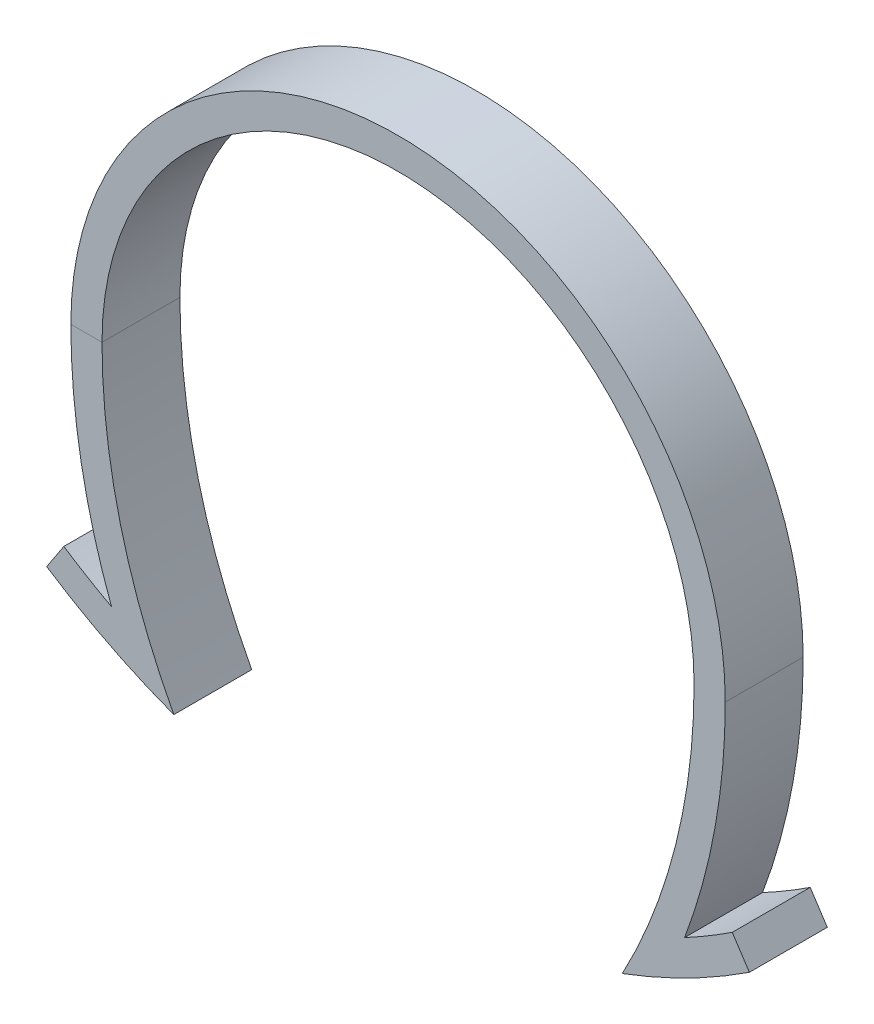
ISO-10303-21;
HEADER;
FILE_DESCRIPTION(('STEP AP214'),'2;1');
FILE_NAME('part.step','',(''),(''),'','','');
FILE_SCHEMA(('AUTOMOTIVE_DESIGN { 1 0 10303 214 1 1 1 1 }'));
ENDSEC;
DATA;
#1=APPLICATION_CONTEXT('core data for automotive mechanical design processes');
#2=APPLICATION_PROTOCOL_DEFINITION('international standard','automotive_design',2000,#1);
#3=PRODUCT_CONTEXT('',#1,'mechanical');
#4=PRODUCT('Part','Part','',(#3));
#5=PRODUCT_RELATED_PRODUCT_CATEGORY('part','',(#4));
#6=PRODUCT_DEFINITION_FORMATION('','',#4);
#7=PRODUCT_DEFINITION_CONTEXT('part definition',#1,'design');
#8=PRODUCT_DEFINITION('design','',#6,#7);
#9=PRODUCT_DEFINITION_SHAPE('','',#8);
#10=(LENGTH_UNIT() NAMED_UNIT(*) SI_UNIT(.MILLI.,.METRE.));
#11=(NAMED_UNIT(*) PLANE_ANGLE_UNIT() SI_UNIT($,.RADIAN.));
#12=(NAMED_UNIT(*) SI_UNIT($,.STERADIAN.) SOLID_ANGLE_UNIT());
#13=UNCERTAINTY_MEASURE_WITH_UNIT(LENGTH_MEASURE(1.E-05),#10,'distance_accuracy_value','');
#14=(GEOMETRIC_REPRESENTATION_CONTEXT(3) GLOBAL_UNCERTAINTY_ASSIGNED_CONTEXT((#13)) GLOBAL_UNIT_ASSIGNED_CONTEXT((#10,
#11,#12)) REPRESENTATION_CONTEXT('',''));
#15=CARTESIAN_POINT('',(0.,0.,0.));
#16=DIRECTION('',(0.,0.,1.));
#17=DIRECTION('',(1.,0.,0.));
#18=AXIS2_PLACEMENT_3D('',#15,#16,#17);
#19=CARTESIAN_POINT('',(39.637607750069,35.6493190269797,5.));
#20=DIRECTION('',(0.,0.,-1.));
#21=DIRECTION('',(-1.,0.,0.));
#22=AXIS2_PLACEMENT_3D('',#19,#20,#21);
#23=CYLINDRICAL_SURFACE('',#22,39.);
#24=CARTESIAN_POINT('',(39.637607750069,35.6493190269797,0.));
#25=DIRECTION('',(0.,0.,1.));
#26=DIRECTION('',(1.,0.,0.));
#27=AXIS2_PLACEMENT_3D('',#24,#25,#26);
#28=CIRCLE('',#27,39.);
#29=CARTESIAN_POINT('',(21.2463213092757,1.2580325861864,0.));
#30=VERTEX_POINT('',#29);
#31=CARTESIAN_POINT('',(18.187607750069,3.07789750442407,0.));
#32=VERTEX_POINT('',#31);
#33=EDGE_CURVE('E166',#30,#32,#28,.F.);
#34=ORIENTED_EDGE('',*,*,#33,.T.);
#35=DIRECTION('',(0.,0.,-1.));
#36=VECTOR('',#35,1.);
#37=CARTESIAN_POINT('',(18.187607750069,3.07789750442407,5.));
#38=LINE('',#37,#36);
#39=CARTESIAN_POINT('',(18.187607750069,3.07789750442407,5.));
#40=VERTEX_POINT('',#39);
#41=EDGE_CURVE('E13',#40,#32,#38,.T.);
#42=ORIENTED_EDGE('',*,*,#41,.F.);
#43=CARTESIAN_POINT('',(39.637607750069,35.6493190269797,5.));
#44=DIRECTION('',(0.,0.,1.));
#45=DIRECTION('',(1.,0.,0.));
#46=AXIS2_PLACEMENT_3D('',#43,#44,#45);
#47=CIRCLE('',#46,39.);
#48=CARTESIAN_POINT('',(21.2463213092757,1.2580325861864,5.));
#49=VERTEX_POINT('',#48);
#50=EDGE_CURVE('E131',#49,#40,#47,.F.);
#51=ORIENTED_EDGE('',*,*,#50,.F.);
#52=DIRECTION('',(0.,0.,-1.));
#53=VECTOR('',#52,1.);
#54=CARTESIAN_POINT('',(21.2463213092757,1.2580325861864,5.));
#55=LINE('',#54,#53);
#56=EDGE_CURVE('E162',#49,#30,#55,.T.);
#57=ORIENTED_EDGE('',*,*,#56,.T.);
#58=EDGE_LOOP('',(#34,#42,#51,#57));
#59=FACE_BOUND('',#58,.T.);
#60=ADVANCED_FACE('F85',(#59),#23,.F.);
#61=CARTESIAN_POINT('',(17.087607750069,1.40756819557506,5.));
#62=DIRECTION('',(-0.835164654424503,0.55,0.));
#63=DIRECTION('',(-0.55,-0.835164654424503,0.));
#64=AXIS2_PLACEMENT_3D('',#61,#62,#63);
#65=PLANE('',#64);
#66=DIRECTION('',(0.55,0.835164654424503,0.));
#67=VECTOR('',#66,1.);
#68=CARTESIAN_POINT('',(17.087607750069,1.40756819557506,0.));
#69=LINE('',#68,#67);
#70=CARTESIAN_POINT('',(17.087607750069,1.40756819557506,0.));
#71=VERTEX_POINT('',#70);
#72=EDGE_CURVE('E169',#71,#32,#69,.T.);
#73=ORIENTED_EDGE('',*,*,#72,.F.);
#74=DIRECTION('',(0.,0.,-1.));
#75=VECTOR('',#74,1.);
#76=CARTESIAN_POINT('',(17.087607750069,1.40756819557506,5.));
#77=LINE('',#76,#75);
#78=CARTESIAN_POINT('',(17.087607750069,1.40756819557506,5.));
#79=VERTEX_POINT('',#78);
#80=EDGE_CURVE('E93',#79,#71,#77,.T.);
#81=ORIENTED_EDGE('',*,*,#80,.F.);
#82=DIRECTION('',(0.55,0.835164654424503,0.));
#83=VECTOR('',#82,1.);
#84=CARTESIAN_POINT('',(17.087607750069,1.40756819557506,5.));
#85=LINE('',#84,#83);
#86=EDGE_CURVE('E255',#79,#40,#85,.T.);
#87=ORIENTED_EDGE('',*,*,#86,.T.);
#88=ORIENTED_EDGE('',*,*,#41,.T.);
#89=EDGE_LOOP('',(#73,#81,#87,#88));
#90=FACE_BOUND('',#89,.T.);
#91=ADVANCED_FACE('F187',(#90),#65,.T.);
#92=CARTESIAN_POINT('',(39.637607750069,35.6493190269797,5.));
#93=DIRECTION('',(0.,0.,-1.));
#94=DIRECTION('',(-1.,0.,0.));
#95=AXIS2_PLACEMENT_3D('',#92,#93,#94);
#96=CYLINDRICAL_SURFACE('',#95,41.);
#97=CARTESIAN_POINT('',(39.637607750069,35.6493190269797,0.));
#98=DIRECTION('',(0.,0.,1.));
#99=DIRECTION('',(1.,0.,0.));
#100=AXIS2_PLACEMENT_3D('',#97,#98,#99);
#101=CIRCLE('',#100,41.);
#102=CARTESIAN_POINT('',(25.2463213092757,-2.74196741381359,0.));
#103=VERTEX_POINT('',#102);
#104=EDGE_CURVE('E172',#103,#71,#101,.F.);
#105=ORIENTED_EDGE('',*,*,#104,.F.);
#106=DIRECTION('',(0.,0.,-1.));
#107=VECTOR('',#106,1.);
#108=CARTESIAN_POINT('',(25.2463213092757,-2.74196741381359,5.));
#109=LINE('',#108,#107);
#110=CARTESIAN_POINT('',(25.2463213092757,-2.74196741381359,5.));
#111=VERTEX_POINT('',#110);
#112=EDGE_CURVE('E152',#111,#103,#109,.T.);
#113=ORIENTED_EDGE('',*,*,#112,.F.);
#114=CARTESIAN_POINT('',(39.637607750069,35.6493190269797,5.));
#115=DIRECTION('',(0.,0.,1.));
#116=DIRECTION('',(1.,0.,0.));
#117=AXIS2_PLACEMENT_3D('',#114,#115,#116);
#118=CIRCLE('',#117,41.);
#119=EDGE_CURVE('E158',#111,#79,#118,.F.);
#120=ORIENTED_EDGE('',*,*,#119,.T.);
#121=ORIENTED_EDGE('',*,*,#80,.T.);
#122=EDGE_LOOP('',(#105,#113,#120,#121));
#123=FACE_BOUND('',#122,.T.);
#124=ADVANCED_FACE('F184',(#123),#96,.T.);
#125=CARTESIAN_POINT('',(59.637607750069,15.6493190269797,5.));
#126=DIRECTION('',(0.,0.,-1.));
#127=DIRECTION('',(-1.,0.,0.));
#128=AXIS2_PLACEMENT_3D('',#125,#126,#127);
#129=CYLINDRICAL_SURFACE('',#128,39.);
#130=CARTESIAN_POINT('',(59.637607750069,15.6493190269797,0.));
#131=DIRECTION('',(0.,0.,1.));
#132=DIRECTION('',(1.,0.,0.));
#133=AXIS2_PLACEMENT_3D('',#130,#131,#132);
#134=CIRCLE('',#133,39.);
#135=CARTESIAN_POINT('',(20.637607750069,15.6493190269797,0.));
#136=VERTEX_POINT('',#135);
#137=EDGE_CURVE('E147',#136,#103,#134,.T.);
#138=ORIENTED_EDGE('',*,*,#137,.F.);
#139=DIRECTION('',(0.,0.,-1.));
#140=VECTOR('',#139,1.);
#141=CARTESIAN_POINT('',(20.637607750069,15.6493190269797,5.));
#142=LINE('',#141,#140);
#143=CARTESIAN_POINT('',(20.637607750069,15.6493190269797,5.));
#144=VERTEX_POINT('',#143);
#145=EDGE_CURVE('E142',#144,#136,#142,.T.);
#146=ORIENTED_EDGE('',*,*,#145,.F.);
#147=CARTESIAN_POINT('',(59.637607750069,15.6493190269797,5.));
#148=DIRECTION('',(0.,0.,1.));
#149=DIRECTION('',(1.,0.,0.));
#150=AXIS2_PLACEMENT_3D('',#147,#148,#149);
#151=CIRCLE('',#150,39.);
#152=EDGE_CURVE('E145',#144,#111,#151,.T.);
#153=ORIENTED_EDGE('',*,*,#152,.T.);
#154=ORIENTED_EDGE('',*,*,#112,.T.);
#155=EDGE_LOOP('',(#138,#146,#153,#154));
#156=FACE_BOUND('',#155,.T.);
#157=ADVANCED_FACE('F144',(#156),#129,.F.);
#158=CARTESIAN_POINT('',(18.637607750069,15.6493190269797,5.));
#159=DIRECTION('',(0.,1.,0.));
#160=DIRECTION('',(0.,0.,1.));
#161=AXIS2_PLACEMENT_3D('',#158,#159,#160);
#162=PLANE('',#161);
#163=DIRECTION('',(1.,0.,0.));
#164=VECTOR('',#163,1.);
#165=CARTESIAN_POINT('',(18.637607750069,15.6493190269797,0.));
#166=LINE('',#165,#164);
#167=CARTESIAN_POINT('',(18.637607750069,15.6493190269797,0.));
#168=VERTEX_POINT('',#167);
#169=EDGE_CURVE('E176',#168,#136,#166,.T.);
#170=ORIENTED_EDGE('',*,*,#169,.F.);
#171=DIRECTION('',(0.,0.,-1.));
#172=VECTOR('',#171,1.);
#173=CARTESIAN_POINT('',(18.637607750069,15.6493190269797,5.));
#174=LINE('',#173,#172);
#175=CARTESIAN_POINT('',(18.637607750069,15.6493190269797,5.));
#176=VERTEX_POINT('',#175);
#177=EDGE_CURVE('E122',#176,#168,#174,.T.);
#178=ORIENTED_EDGE('',*,*,#177,.F.);
#179=DIRECTION('',(1.,0.,0.));
#180=VECTOR('',#179,1.);
#181=CARTESIAN_POINT('',(18.637607750069,15.6493190269797,5.));
#182=LINE('',#181,#180);
#183=EDGE_CURVE('E156',#176,#144,#182,.T.);
#184=ORIENTED_EDGE('',*,*,#183,.T.);
#185=ORIENTED_EDGE('',*,*,#145,.T.);
#186=EDGE_LOOP('',(#170,#178,#184,#185));
#187=FACE_BOUND('',#186,.T.);
#188=ADVANCED_FACE('F160',(#187),#162,.T.);
#189=CARTESIAN_POINT('',(59.637607750069,15.6493190269797,5.));
#190=DIRECTION('',(0.,0.,-1.));
#191=DIRECTION('',(-1.,0.,0.));
#192=AXIS2_PLACEMENT_3D('',#189,#190,#191);
#193=CYLINDRICAL_SURFACE('',#192,41.);
#194=CARTESIAN_POINT('',(59.637607750069,15.6493190269797,0.));
#195=DIRECTION('',(0.,0.,1.));
#196=DIRECTION('',(1.,0.,0.));
#197=AXIS2_PLACEMENT_3D('',#194,#195,#196);
#198=CIRCLE('',#197,41.);
#199=EDGE_CURVE('E125',#168,#30,#198,.T.);
#200=ORIENTED_EDGE('',*,*,#199,.T.);
#201=ORIENTED_EDGE('',*,*,#56,.F.);
#202=CARTESIAN_POINT('',(59.637607750069,15.6493190269797,5.));
#203=DIRECTION('',(0.,0.,1.));
#204=DIRECTION('',(1.,0.,0.));
#205=AXIS2_PLACEMENT_3D('',#202,#203,#204);
#206=CIRCLE('',#205,41.);
#207=EDGE_CURVE('E101',#176,#49,#206,.T.);
#208=ORIENTED_EDGE('',*,*,#207,.F.);
#209=ORIENTED_EDGE('',*,*,#177,.T.);
#210=EDGE_LOOP('',(#200,#201,#208,#209));
#211=FACE_BOUND('',#210,.T.);
#212=ADVANCED_FACE('F192',(#211),#193,.T.);
#213=CARTESIAN_POINT('',(39.637607750069,35.6493190269797,5.));
#214=DIRECTION('',(0.,0.,1.));
#215=DIRECTION('',(1.,0.,0.));
#216=AXIS2_PLACEMENT_3D('',#213,#214,#215);
#217=PLANE('',#216);
#218=ORIENTED_EDGE('',*,*,#50,.T.);
#219=ORIENTED_EDGE('',*,*,#86,.F.);
#220=ORIENTED_EDGE('',*,*,#119,.F.);
#221=ORIENTED_EDGE('',*,*,#152,.F.);
#222=ORIENTED_EDGE('',*,*,#183,.F.);
#223=ORIENTED_EDGE('',*,*,#207,.T.);
#224=EDGE_LOOP('',(#218,#219,#220,#221,#222,#223));
#225=FACE_BOUND('',#224,.T.);
#226=ADVANCED_FACE('F155',(#225),#217,.T.);
#227=CARTESIAN_POINT('',(39.637607750069,35.6493190269797,0.));
#228=DIRECTION('',(0.,0.,1.));
#229=DIRECTION('',(1.,0.,0.));
#230=AXIS2_PLACEMENT_3D('',#227,#228,#229);
#231=PLANE('',#230);
#232=ORIENTED_EDGE('',*,*,#33,.F.);
#233=ORIENTED_EDGE('',*,*,#199,.F.);
#234=ORIENTED_EDGE('',*,*,#169,.T.);
#235=ORIENTED_EDGE('',*,*,#137,.T.);
#236=ORIENTED_EDGE('',*,*,#104,.T.);
#237=ORIENTED_EDGE('',*,*,#72,.T.);
#238=EDGE_LOOP('',(#232,#233,#234,#235,#236,#237));
#239=FACE_BOUND('',#238,.T.);
#240=ADVANCED_FACE('F190',(#239),#231,.F.);
#241=CLOSED_SHELL('',(#60,#91,#124,#157,#188,#212,#226,#240));
#242=MANIFOLD_SOLID_BREP('B2',#241);
#243=CARTESIAN_POINT('',(39.637607750069,15.6493190269797,5.));
#244=DIRECTION('',(0.,0.,-1.));
#245=DIRECTION('',(-1.,0.,0.));
#246=AXIS2_PLACEMENT_3D('',#243,#244,#245);
#247=CYLINDRICAL_SURFACE('',#246,21.);
#248=CARTESIAN_POINT('',(39.637607750069,15.6493190269797,0.));
#249=DIRECTION('',(0.,0.,1.));
#250=DIRECTION('',(1.,0.,0.));
#251=AXIS2_PLACEMENT_3D('',#248,#249,#250);
#252=CIRCLE('',#251,21.);
#253=CARTESIAN_POINT('',(60.637607750069,15.6493190269797,0.));
#254=VERTEX_POINT('',#253);
#255=CARTESIAN_POINT('',(18.637607750069,15.6493190269797,0.));
#256=VERTEX_POINT('',#255);
#257=EDGE_CURVE('E358',#254,#256,#252,.T.);
#258=ORIENTED_EDGE('',*,*,#257,.T.);
#259=DIRECTION('',(0.,0.,-1.));
#260=VECTOR('',#259,1.);
#261=CARTESIAN_POINT('',(18.637607750069,15.6493190269797,5.));
#262=LINE('',#261,#260);
#263=CARTESIAN_POINT('',(18.637607750069,15.6493190269797,5.));
#264=VERTEX_POINT('',#263);
#265=EDGE_CURVE('E83',#264,#256,#262,.T.);
#266=ORIENTED_EDGE('',*,*,#265,.F.);
#267=CARTESIAN_POINT('',(39.637607750069,15.6493190269797,5.));
#268=DIRECTION('',(0.,0.,1.));
#269=DIRECTION('',(1.,0.,0.));
#270=AXIS2_PLACEMENT_3D('',#267,#268,#269);
#271=CIRCLE('',#270,21.);
#272=CARTESIAN_POINT('',(60.637607750069,15.6493190269797,5.));
#273=VERTEX_POINT('',#272);
#274=EDGE_CURVE('E316',#273,#264,#271,.T.);
#275=ORIENTED_EDGE('',*,*,#274,.F.);
#276=DIRECTION('',(0.,0.,-1.));
#277=VECTOR('',#276,1.);
#278=CARTESIAN_POINT('',(60.637607750069,15.6493190269797,5.));
#279=LINE('',#278,#277);
#280=EDGE_CURVE('E357',#273,#254,#279,.T.);
#281=ORIENTED_EDGE('',*,*,#280,.T.);
#282=EDGE_LOOP('',(#258,#266,#275,#281));
#283=FACE_BOUND('',#282,.T.);
#284=ADVANCED_FACE('F261',(#283),#247,.T.);
#285=CARTESIAN_POINT('',(20.637607750069,15.6493190269797,5.));
#286=DIRECTION('',(0.,-1.,0.));
#287=DIRECTION('',(0.,0.,-1.));
#288=AXIS2_PLACEMENT_3D('',#285,#286,#287);
#289=PLANE('',#288);
#290=DIRECTION('',(-1.,0.,0.));
#291=VECTOR('',#290,1.);
#292=CARTESIAN_POINT('',(20.637607750069,15.6493190269797,0.));
#293=LINE('',#292,#291);
#294=CARTESIAN_POINT('',(20.637607750069,15.6493190269797,0.));
#295=VERTEX_POINT('',#294);
#296=EDGE_CURVE('E361',#295,#256,#293,.T.);
#297=ORIENTED_EDGE('',*,*,#296,.F.);
#298=DIRECTION('',(0.,0.,-1.));
#299=VECTOR('',#298,1.);
#300=CARTESIAN_POINT('',(20.637607750069,15.6493190269797,5.));
#301=LINE('',#300,#299);
#302=CARTESIAN_POINT('',(20.637607750069,15.6493190269797,5.));
#303=VERTEX_POINT('',#302);
#304=EDGE_CURVE('E269',#303,#295,#301,.T.);
#305=ORIENTED_EDGE('',*,*,#304,.F.);
#306=DIRECTION('',(-1.,0.,0.));
#307=VECTOR('',#306,1.);
#308=CARTESIAN_POINT('',(20.637607750069,15.6493190269797,5.));
#309=LINE('',#308,#307);
#310=EDGE_CURVE('E400',#303,#264,#309,.T.);
#311=ORIENTED_EDGE('',*,*,#310,.T.);
#312=ORIENTED_EDGE('',*,*,#265,.T.);
#313=EDGE_LOOP('',(#297,#305,#311,#312));
#314=FACE_BOUND('',#313,.T.);
#315=ADVANCED_FACE('F391',(#314),#289,.T.);
#316=CARTESIAN_POINT('',(39.637607750069,15.6493190269797,5.));
#317=DIRECTION('',(0.,0.,-1.));
#318=DIRECTION('',(-1.,0.,0.));
#319=AXIS2_PLACEMENT_3D('',#316,#317,#318);
#320=CYLINDRICAL_SURFACE('',#319,19.);
#321=CARTESIAN_POINT('',(39.637607750069,15.6493190269797,0.));
#322=DIRECTION('',(0.,0.,1.));
#323=DIRECTION('',(1.,0.,0.));
#324=AXIS2_PLACEMENT_3D('',#321,#322,#323);
#325=CIRCLE('',#324,19.);
#326=CARTESIAN_POINT('',(58.637607750069,15.6493190269797,0.));
#327=VERTEX_POINT('',#326);
#328=EDGE_CURVE('E364',#327,#295,#325,.T.);
#329=ORIENTED_EDGE('',*,*,#328,.F.);
#330=DIRECTION('',(0.,0.,-1.));
#331=VECTOR('',#330,1.);
#332=CARTESIAN_POINT('',(58.637607750069,15.6493190269797,5.));
#333=LINE('',#332,#331);
#334=CARTESIAN_POINT('',(58.637607750069,15.6493190269797,5.));
#335=VERTEX_POINT('',#334);
#336=EDGE_CURVE('E381',#335,#327,#333,.T.);
#337=ORIENTED_EDGE('',*,*,#336,.F.);
#338=CARTESIAN_POINT('',(39.637607750069,15.6493190269797,5.));
#339=DIRECTION('',(0.,0.,1.));
#340=DIRECTION('',(1.,0.,0.));
#341=AXIS2_PLACEMENT_3D('',#338,#339,#340);
#342=CIRCLE('',#341,19.);
#343=EDGE_CURVE('E388',#335,#303,#342,.T.);
#344=ORIENTED_EDGE('',*,*,#343,.T.);
#345=ORIENTED_EDGE('',*,*,#304,.T.);
#346=EDGE_LOOP('',(#329,#337,#344,#345));
#347=FACE_BOUND('',#346,.T.);
#348=ADVANCED_FACE('F386',(#347),#320,.F.);
#349=CARTESIAN_POINT('',(19.637607750069,15.6493190269797,5.));
#350=DIRECTION('',(0.,0.,-1.));
#351=DIRECTION('',(-1.,0.,0.));
#352=AXIS2_PLACEMENT_3D('',#349,#350,#351);
#353=CYLINDRICAL_SURFACE('',#352,39.);
#354=CARTESIAN_POINT('',(19.637607750069,15.6493190269797,0.));
#355=DIRECTION('',(0.,0.,1.));
#356=DIRECTION('',(1.,0.,0.));
#357=AXIS2_PLACEMENT_3D('',#354,#355,#356);
#358=CIRCLE('',#357,39.);
#359=CARTESIAN_POINT('',(54.0288941908623,-2.74196741381358,0.));
#360=VERTEX_POINT('',#359);
#361=EDGE_CURVE('E367',#360,#327,#358,.T.);
#362=ORIENTED_EDGE('',*,*,#361,.F.);
#363=DIRECTION('',(0.,0.,-1.));
#364=VECTOR('',#363,1.);
#365=CARTESIAN_POINT('',(54.0288941908623,-2.74196741381358,5.));
#366=LINE('',#365,#364);
#367=CARTESIAN_POINT('',(54.0288941908623,-2.74196741381358,5.));
#368=VERTEX_POINT('',#367);
#369=EDGE_CURVE('E379',#368,#360,#366,.T.);
#370=ORIENTED_EDGE('',*,*,#369,.F.);
#371=CARTESIAN_POINT('',(19.637607750069,15.6493190269797,5.));
#372=DIRECTION('',(0.,0.,1.));
#373=DIRECTION('',(1.,0.,0.));
#374=AXIS2_PLACEMENT_3D('',#371,#372,#373);
#375=CIRCLE('',#374,39.);
#376=EDGE_CURVE('E352',#368,#335,#375,.T.);
#377=ORIENTED_EDGE('',*,*,#376,.T.);
#378=ORIENTED_EDGE('',*,*,#336,.T.);
#379=EDGE_LOOP('',(#362,#370,#377,#378));
#380=FACE_BOUND('',#379,.T.);
#381=ADVANCED_FACE('F398',(#380),#353,.F.);
#382=CARTESIAN_POINT('',(39.637607750069,35.6493190269797,5.));
#383=DIRECTION('',(0.,0.,-1.));
#384=DIRECTION('',(-1.,0.,0.));
#385=AXIS2_PLACEMENT_3D('',#382,#383,#384);
#386=CYLINDRICAL_SURFACE('',#385,41.);
#387=CARTESIAN_POINT('',(39.637607750069,35.6493190269797,0.));
#388=DIRECTION('',(0.,0.,1.));
#389=DIRECTION('',(1.,0.,0.));
#390=AXIS2_PLACEMENT_3D('',#387,#388,#389);
#391=CIRCLE('',#390,41.);
#392=CARTESIAN_POINT('',(62.1876077500689,1.40756819557505,0.));
#393=VERTEX_POINT('',#392);
#394=EDGE_CURVE('E370',#393,#360,#391,.F.);
#395=ORIENTED_EDGE('',*,*,#394,.F.);
#396=DIRECTION('',(0.,0.,-1.));
#397=VECTOR('',#396,1.);
#398=CARTESIAN_POINT('',(62.1876077500689,1.40756819557505,5.));
#399=LINE('',#398,#397);
#400=CARTESIAN_POINT('',(62.1876077500689,1.40756819557505,5.));
#401=VERTEX_POINT('',#400);
#402=EDGE_CURVE('E340',#401,#393,#399,.T.);
#403=ORIENTED_EDGE('',*,*,#402,.F.);
#404=CARTESIAN_POINT('',(39.637607750069,35.6493190269797,5.));
#405=DIRECTION('',(0.,0.,1.));
#406=DIRECTION('',(1.,0.,0.));
#407=AXIS2_PLACEMENT_3D('',#404,#405,#406);
#408=CIRCLE('',#407,41.);
#409=EDGE_CURVE('E350',#401,#368,#408,.F.);
#410=ORIENTED_EDGE('',*,*,#409,.T.);
#411=ORIENTED_EDGE('',*,*,#369,.T.);
#412=EDGE_LOOP('',(#395,#403,#410,#411));
#413=FACE_BOUND('',#412,.T.);
#414=ADVANCED_FACE('F405',(#413),#386,.T.);
#415=CARTESIAN_POINT('',(61.0876077500689,3.07789750442407,5.));
#416=DIRECTION('',(0.835164654424505,0.549999999999997,0.));
#417=DIRECTION('',(-0.549999999999997,0.835164654424505,0.));
#418=AXIS2_PLACEMENT_3D('',#415,#416,#417);
#419=PLANE('',#418);
#420=DIRECTION('',(0.549999999999997,-0.835164654424505,0.));
#421=VECTOR('',#420,1.);
#422=CARTESIAN_POINT('',(61.0876077500689,3.07789750442407,0.));
#423=LINE('',#422,#421);
#424=CARTESIAN_POINT('',(61.0876077500689,3.07789750442407,0.));
#425=VERTEX_POINT('',#424);
#426=EDGE_CURVE('E339',#425,#393,#423,.T.);
#427=ORIENTED_EDGE('',*,*,#426,.F.);
#428=DIRECTION('',(0.,0.,-1.));
#429=VECTOR('',#428,1.);
#430=CARTESIAN_POINT('',(61.0876077500689,3.07789750442407,5.));
#431=LINE('',#430,#429);
#432=CARTESIAN_POINT('',(61.0876077500689,3.07789750442407,5.));
#433=VERTEX_POINT('',#432);
#434=EDGE_CURVE('E333',#433,#425,#431,.T.);
#435=ORIENTED_EDGE('',*,*,#434,.F.);
#436=DIRECTION('',(0.549999999999997,-0.835164654424505,0.));
#437=VECTOR('',#436,1.);
#438=CARTESIAN_POINT('',(61.0876077500689,3.07789750442407,5.));
#439=LINE('',#438,#437);
#440=EDGE_CURVE('E337',#433,#401,#439,.T.);
#441=ORIENTED_EDGE('',*,*,#440,.T.);
#442=ORIENTED_EDGE('',*,*,#402,.T.);
#443=EDGE_LOOP('',(#427,#435,#441,#442));
#444=FACE_BOUND('',#443,.T.);
#445=ADVANCED_FACE('F335',(#444),#419,.T.);
#446=CARTESIAN_POINT('',(39.637607750069,35.6493190269797,5.));
#447=DIRECTION('',(0.,0.,-1.));
#448=DIRECTION('',(-1.,0.,0.));
#449=AXIS2_PLACEMENT_3D('',#446,#447,#448);
#450=CYLINDRICAL_SURFACE('',#449,39.);
#451=CARTESIAN_POINT('',(39.637607750069,35.6493190269797,0.));
#452=DIRECTION('',(0.,0.,1.));
#453=DIRECTION('',(1.,0.,0.));
#454=AXIS2_PLACEMENT_3D('',#451,#452,#453);
#455=CIRCLE('',#454,39.);
#456=CARTESIAN_POINT('',(58.0288941908623,1.25803258618642,0.));
#457=VERTEX_POINT('',#456);
#458=EDGE_CURVE('E304',#425,#457,#455,.F.);
#459=ORIENTED_EDGE('',*,*,#458,.T.);
#460=DIRECTION('',(0.,0.,-1.));
#461=VECTOR('',#460,1.);
#462=CARTESIAN_POINT('',(58.0288941908623,1.25803258618642,5.));
#463=LINE('',#462,#461);
#464=CARTESIAN_POINT('',(58.0288941908623,1.25803258618642,5.));
#465=VERTEX_POINT('',#464);
#466=EDGE_CURVE('E341',#465,#457,#463,.T.);
#467=ORIENTED_EDGE('',*,*,#466,.F.);
#468=CARTESIAN_POINT('',(39.637607750069,35.6493190269797,5.));
#469=DIRECTION('',(0.,0.,1.));
#470=DIRECTION('',(1.,0.,0.));
#471=AXIS2_PLACEMENT_3D('',#468,#469,#470);
#472=CIRCLE('',#471,39.);
#473=EDGE_CURVE('E343',#433,#465,#472,.F.);
#474=ORIENTED_EDGE('',*,*,#473,.F.);
#475=ORIENTED_EDGE('',*,*,#434,.T.);
#476=EDGE_LOOP('',(#459,#467,#474,#475));
#477=FACE_BOUND('',#476,.T.);
#478=ADVANCED_FACE('F344',(#477),#450,.F.);
#479=CARTESIAN_POINT('',(19.637607750069,15.6493190269797,5.));
#480=DIRECTION('',(0.,0.,-1.));
#481=DIRECTION('',(-1.,0.,0.));
#482=AXIS2_PLACEMENT_3D('',#479,#480,#481);
#483=CYLINDRICAL_SURFACE('',#482,41.);
#484=CARTESIAN_POINT('',(19.637607750069,15.6493190269797,0.));
#485=DIRECTION('',(0.,0.,1.));
#486=DIRECTION('',(1.,0.,0.));
#487=AXIS2_PLACEMENT_3D('',#484,#485,#486);
#488=CIRCLE('',#487,41.);
#489=EDGE_CURVE('E310',#457,#254,#488,.T.);
#490=ORIENTED_EDGE('',*,*,#489,.T.);
#491=ORIENTED_EDGE('',*,*,#280,.F.);
#492=CARTESIAN_POINT('',(19.637607750069,15.6493190269797,5.));
#493=DIRECTION('',(0.,0.,1.));
#494=DIRECTION('',(1.,0.,0.));
#495=AXIS2_PLACEMENT_3D('',#492,#493,#494);
#496=CIRCLE('',#495,41.);
#497=EDGE_CURVE('E277',#465,#273,#496,.T.);
#498=ORIENTED_EDGE('',*,*,#497,.F.);
#499=ORIENTED_EDGE('',*,*,#466,.T.);
#500=EDGE_LOOP('',(#490,#491,#498,#499));
#501=FACE_BOUND('',#500,.T.);
#502=ADVANCED_FACE('F407',(#501),#483,.T.);
#503=CARTESIAN_POINT('',(39.637607750069,15.6493190269797,5.));
#504=DIRECTION('',(0.,0.,1.));
#505=DIRECTION('',(1.,0.,0.));
#506=AXIS2_PLACEMENT_3D('',#503,#504,#505);
#507=PLANE('',#506);
#508=ORIENTED_EDGE('',*,*,#274,.T.);
#509=ORIENTED_EDGE('',*,*,#310,.F.);
#510=ORIENTED_EDGE('',*,*,#343,.F.);
#511=ORIENTED_EDGE('',*,*,#376,.F.);
#512=ORIENTED_EDGE('',*,*,#409,.F.);
#513=ORIENTED_EDGE('',*,*,#440,.F.);
#514=ORIENTED_EDGE('',*,*,#473,.T.);
#515=ORIENTED_EDGE('',*,*,#497,.T.);
#516=EDGE_LOOP('',(#508,#509,#510,#511,#512,#513,#514,#515));
#517=FACE_BOUND('',#516,.T.);
#518=ADVANCED_FACE('F347',(#517),#507,.T.);
#519=CARTESIAN_POINT('',(39.637607750069,15.6493190269797,0.));
#520=DIRECTION('',(0.,0.,1.));
#521=DIRECTION('',(1.,0.,0.));
#522=AXIS2_PLACEMENT_3D('',#519,#520,#521);
#523=PLANE('',#522);
#524=ORIENTED_EDGE('',*,*,#257,.F.);
#525=ORIENTED_EDGE('',*,*,#489,.F.);
#526=ORIENTED_EDGE('',*,*,#458,.F.);
#527=ORIENTED_EDGE('',*,*,#426,.T.);
#528=ORIENTED_EDGE('',*,*,#394,.T.);
#529=ORIENTED_EDGE('',*,*,#361,.T.);
#530=ORIENTED_EDGE('',*,*,#328,.T.);
#531=ORIENTED_EDGE('',*,*,#296,.T.);
#532=EDGE_LOOP('',(#524,#525,#526,#527,#528,#529,#530,#531));
#533=FACE_BOUND('',#532,.T.);
#534=ADVANCED_FACE('F394',(#533),#523,.F.);
#535=CLOSED_SHELL('',(#284,#315,#348,#381,#414,#445,#478,#502,#518,#534));
#536=MANIFOLD_SOLID_BREP('B7',#535);
#537=ADVANCED_BREP_SHAPE_REPRESENTATION('',(#18,#242,#536),#14);
#538=SHAPE_DEFINITION_REPRESENTATION(#9,#537);
ENDSEC;
END-ISO-10303-21;
